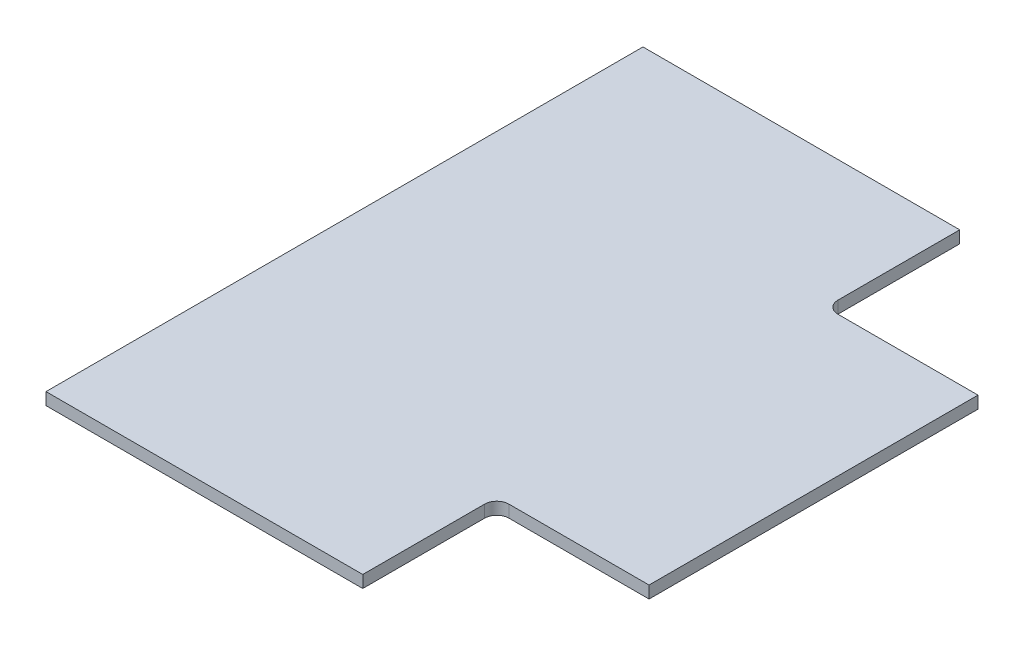
ISO-10303-21;
HEADER;
FILE_DESCRIPTION(('STEP AP214'),'2;1');
FILE_NAME('part.step','',(''),(''),'','','');
FILE_SCHEMA(('AUTOMOTIVE_DESIGN { 1 0 10303 214 1 1 1 1 }'));
ENDSEC;
DATA;
#1=APPLICATION_CONTEXT('core data for automotive mechanical design processes');
#2=APPLICATION_PROTOCOL_DEFINITION('international standard','automotive_design',2000,#1);
#3=PRODUCT_CONTEXT('',#1,'mechanical');
#4=PRODUCT('Part','Part','',(#3));
#5=PRODUCT_RELATED_PRODUCT_CATEGORY('part','',(#4));
#6=PRODUCT_DEFINITION_FORMATION('','',#4);
#7=PRODUCT_DEFINITION_CONTEXT('part definition',#1,'design');
#8=PRODUCT_DEFINITION('design','',#6,#7);
#9=PRODUCT_DEFINITION_SHAPE('','',#8);
#10=(LENGTH_UNIT() NAMED_UNIT(*) SI_UNIT(.MILLI.,.METRE.));
#11=(NAMED_UNIT(*) PLANE_ANGLE_UNIT() SI_UNIT($,.RADIAN.));
#12=(NAMED_UNIT(*) SI_UNIT($,.STERADIAN.) SOLID_ANGLE_UNIT());
#13=UNCERTAINTY_MEASURE_WITH_UNIT(LENGTH_MEASURE(1.E-05),#10,'distance_accuracy_value','');
#14=(GEOMETRIC_REPRESENTATION_CONTEXT(3) GLOBAL_UNCERTAINTY_ASSIGNED_CONTEXT((#13)) GLOBAL_UNIT_ASSIGNED_CONTEXT((#10,
#11,#12)) REPRESENTATION_CONTEXT('',''));
#15=CARTESIAN_POINT('',(0.,0.,0.));
#16=DIRECTION('',(0.,0.,1.));
#17=DIRECTION('',(1.,0.,0.));
#18=AXIS2_PLACEMENT_3D('',#15,#16,#17);
#19=CARTESIAN_POINT('',(52.,2.,49.));
#20=DIRECTION('',(0.,0.,-1.));
#21=DIRECTION('',(-1.,0.,0.));
#22=AXIS2_PLACEMENT_3D('',#19,#20,#21);
#23=PLANE('',#22);
#24=DIRECTION('',(1.,0.,0.));
#25=VECTOR('',#24,1.);
#26=CARTESIAN_POINT('',(52.,0.,49.));
#27=LINE('',#26,#25);
#28=CARTESIAN_POINT('',(0.,0.,49.));
#29=VERTEX_POINT('',#28);
#30=CARTESIAN_POINT('',(52.,0.,49.));
#31=VERTEX_POINT('',#30);
#32=EDGE_CURVE('E141',#29,#31,#27,.T.);
#33=ORIENTED_EDGE('',*,*,#32,.T.);
#34=DIRECTION('',(0.,-1.,0.));
#35=VECTOR('',#34,1.);
#36=CARTESIAN_POINT('',(52.,2.,49.));
#37=LINE('',#36,#35);
#38=CARTESIAN_POINT('',(52.,2.,49.));
#39=VERTEX_POINT('',#38);
#40=EDGE_CURVE('E11',#39,#31,#37,.T.);
#41=ORIENTED_EDGE('',*,*,#40,.F.);
#42=DIRECTION('',(1.,0.,0.));
#43=VECTOR('',#42,1.);
#44=CARTESIAN_POINT('',(52.,2.,49.));
#45=LINE('',#44,#43);
#46=CARTESIAN_POINT('',(0.,2.,49.));
#47=VERTEX_POINT('',#46);
#48=EDGE_CURVE('E159',#47,#39,#45,.T.);
#49=ORIENTED_EDGE('',*,*,#48,.F.);
#50=DIRECTION('',(0.,-1.,0.));
#51=VECTOR('',#50,1.);
#52=CARTESIAN_POINT('',(0.,2.,49.));
#53=LINE('',#52,#51);
#54=EDGE_CURVE('E137',#47,#29,#53,.T.);
#55=ORIENTED_EDGE('',*,*,#54,.T.);
#56=EDGE_LOOP('',(#33,#41,#49,#55));
#57=FACE_BOUND('',#56,.T.);
#58=ADVANCED_FACE('F33',(#57),#23,.F.);
#59=CARTESIAN_POINT('',(52.,2.,29.));
#60=DIRECTION('',(-1.,0.,0.));
#61=DIRECTION('',(0.,0.,1.));
#62=AXIS2_PLACEMENT_3D('',#59,#60,#61);
#63=PLANE('',#62);
#64=DIRECTION('',(0.,0.,-1.));
#65=VECTOR('',#64,1.);
#66=CARTESIAN_POINT('',(52.,0.,29.));
#67=LINE('',#66,#65);
#68=CARTESIAN_POINT('',(52.,0.,29.));
#69=VERTEX_POINT('',#68);
#70=EDGE_CURVE('E144',#31,#69,#67,.T.);
#71=ORIENTED_EDGE('',*,*,#70,.T.);
#72=DIRECTION('',(0.,-1.,0.));
#73=VECTOR('',#72,1.);
#74=CARTESIAN_POINT('',(52.,2.,29.));
#75=LINE('',#74,#73);
#76=CARTESIAN_POINT('',(52.,2.,29.));
#77=VERTEX_POINT('',#76);
#78=EDGE_CURVE('E41',#77,#69,#75,.T.);
#79=ORIENTED_EDGE('',*,*,#78,.F.);
#80=DIRECTION('',(0.,0.,-1.));
#81=VECTOR('',#80,1.);
#82=CARTESIAN_POINT('',(52.,2.,29.));
#83=LINE('',#82,#81);
#84=EDGE_CURVE('E98',#39,#77,#83,.T.);
#85=ORIENTED_EDGE('',*,*,#84,.F.);
#86=ORIENTED_EDGE('',*,*,#40,.T.);
#87=EDGE_LOOP('',(#71,#79,#85,#86));
#88=FACE_BOUND('',#87,.T.);
#89=ADVANCED_FACE('F208',(#88),#63,.F.);
#90=CARTESIAN_POINT('',(54.,2.,29.));
#91=DIRECTION('',(0.,-1.,0.));
#92=DIRECTION('',(0.,0.,-1.));
#93=AXIS2_PLACEMENT_3D('',#90,#91,#92);
#94=CYLINDRICAL_SURFACE('',#93,2.);
#95=CARTESIAN_POINT('',(54.,0.,29.));
#96=DIRECTION('',(0.,-1.,0.));
#97=DIRECTION('',(0.,0.,1.));
#98=AXIS2_PLACEMENT_3D('',#95,#96,#97);
#99=CIRCLE('',#98,2.);
#100=CARTESIAN_POINT('',(54.,0.,27.));
#101=VERTEX_POINT('',#100);
#102=EDGE_CURVE('E146',#69,#101,#99,.T.);
#103=ORIENTED_EDGE('',*,*,#102,.T.);
#104=DIRECTION('',(0.,-1.,0.));
#105=VECTOR('',#104,1.);
#106=CARTESIAN_POINT('',(54.,2.,27.));
#107=LINE('',#106,#105);
#108=CARTESIAN_POINT('',(54.,2.,27.));
#109=VERTEX_POINT('',#108);
#110=EDGE_CURVE('E172',#109,#101,#107,.T.);
#111=ORIENTED_EDGE('',*,*,#110,.F.);
#112=CARTESIAN_POINT('',(54.,2.,29.));
#113=DIRECTION('',(0.,-1.,0.));
#114=DIRECTION('',(0.,0.,1.));
#115=AXIS2_PLACEMENT_3D('',#112,#113,#114);
#116=CIRCLE('',#115,2.);
#117=EDGE_CURVE('E180',#77,#109,#116,.T.);
#118=ORIENTED_EDGE('',*,*,#117,.F.);
#119=ORIENTED_EDGE('',*,*,#78,.T.);
#120=EDGE_LOOP('',(#103,#111,#118,#119));
#121=FACE_BOUND('',#120,.T.);
#122=ADVANCED_FACE('F178',(#121),#94,.F.);
#123=CARTESIAN_POINT('',(77.,2.,27.));
#124=DIRECTION('',(0.,0.,-1.));
#125=DIRECTION('',(-1.,0.,0.));
#126=AXIS2_PLACEMENT_3D('',#123,#124,#125);
#127=PLANE('',#126);
#128=DIRECTION('',(1.,0.,0.));
#129=VECTOR('',#128,1.);
#130=CARTESIAN_POINT('',(77.,0.,27.));
#131=LINE('',#130,#129);
#132=CARTESIAN_POINT('',(77.,0.,27.));
#133=VERTEX_POINT('',#132);
#134=EDGE_CURVE('E148',#101,#133,#131,.T.);
#135=ORIENTED_EDGE('',*,*,#134,.T.);
#136=DIRECTION('',(0.,-1.,0.));
#137=VECTOR('',#136,1.);
#138=CARTESIAN_POINT('',(77.,2.,27.));
#139=LINE('',#138,#137);
#140=CARTESIAN_POINT('',(77.,2.,27.));
#141=VERTEX_POINT('',#140);
#142=EDGE_CURVE('E169',#141,#133,#139,.T.);
#143=ORIENTED_EDGE('',*,*,#142,.F.);
#144=DIRECTION('',(1.,0.,0.));
#145=VECTOR('',#144,1.);
#146=CARTESIAN_POINT('',(77.,2.,27.));
#147=LINE('',#146,#145);
#148=EDGE_CURVE('E198',#109,#141,#147,.T.);
#149=ORIENTED_EDGE('',*,*,#148,.F.);
#150=ORIENTED_EDGE('',*,*,#110,.T.);
#151=EDGE_LOOP('',(#135,#143,#149,#150));
#152=FACE_BOUND('',#151,.T.);
#153=ADVANCED_FACE('F189',(#152),#127,.F.);
#154=CARTESIAN_POINT('',(77.,2.,-27.));
#155=DIRECTION('',(-1.,0.,0.));
#156=DIRECTION('',(0.,0.,1.));
#157=AXIS2_PLACEMENT_3D('',#154,#155,#156);
#158=PLANE('',#157);
#159=DIRECTION('',(0.,0.,-1.));
#160=VECTOR('',#159,1.);
#161=CARTESIAN_POINT('',(77.,0.,-27.));
#162=LINE('',#161,#160);
#163=CARTESIAN_POINT('',(77.,0.,-27.));
#164=VERTEX_POINT('',#163);
#165=EDGE_CURVE('E150',#133,#164,#162,.T.);
#166=ORIENTED_EDGE('',*,*,#165,.T.);
#167=DIRECTION('',(0.,-1.,0.));
#168=VECTOR('',#167,1.);
#169=CARTESIAN_POINT('',(77.,2.,-27.));
#170=LINE('',#169,#168);
#171=CARTESIAN_POINT('',(77.,2.,-27.));
#172=VERTEX_POINT('',#171);
#173=EDGE_CURVE('E166',#172,#164,#170,.T.);
#174=ORIENTED_EDGE('',*,*,#173,.F.);
#175=DIRECTION('',(0.,0.,-1.));
#176=VECTOR('',#175,1.);
#177=CARTESIAN_POINT('',(77.,2.,-27.));
#178=LINE('',#177,#176);
#179=EDGE_CURVE('E195',#141,#172,#178,.T.);
#180=ORIENTED_EDGE('',*,*,#179,.F.);
#181=ORIENTED_EDGE('',*,*,#142,.T.);
#182=EDGE_LOOP('',(#166,#174,#180,#181));
#183=FACE_BOUND('',#182,.T.);
#184=ADVANCED_FACE('F193',(#183),#158,.F.);
#185=CARTESIAN_POINT('',(54.,2.,-27.));
#186=DIRECTION('',(0.,0.,1.));
#187=DIRECTION('',(1.,0.,0.));
#188=AXIS2_PLACEMENT_3D('',#185,#186,#187);
#189=PLANE('',#188);
#190=DIRECTION('',(-1.,0.,0.));
#191=VECTOR('',#190,1.);
#192=CARTESIAN_POINT('',(54.,0.,-27.));
#193=LINE('',#192,#191);
#194=CARTESIAN_POINT('',(54.,0.,-27.));
#195=VERTEX_POINT('',#194);
#196=EDGE_CURVE('E152',#164,#195,#193,.T.);
#197=ORIENTED_EDGE('',*,*,#196,.T.);
#198=DIRECTION('',(0.,-1.,0.));
#199=VECTOR('',#198,1.);
#200=CARTESIAN_POINT('',(54.,2.,-27.));
#201=LINE('',#200,#199);
#202=CARTESIAN_POINT('',(54.,2.,-27.));
#203=VERTEX_POINT('',#202);
#204=EDGE_CURVE('E163',#203,#195,#201,.T.);
#205=ORIENTED_EDGE('',*,*,#204,.F.);
#206=DIRECTION('',(-1.,0.,0.));
#207=VECTOR('',#206,1.);
#208=CARTESIAN_POINT('',(54.,2.,-27.));
#209=LINE('',#208,#207);
#210=EDGE_CURVE('E197',#172,#203,#209,.T.);
#211=ORIENTED_EDGE('',*,*,#210,.F.);
#212=ORIENTED_EDGE('',*,*,#173,.T.);
#213=EDGE_LOOP('',(#197,#205,#211,#212));
#214=FACE_BOUND('',#213,.T.);
#215=ADVANCED_FACE('F220',(#214),#189,.F.);
#216=CARTESIAN_POINT('',(54.,2.,-29.));
#217=DIRECTION('',(0.,-1.,0.));
#218=DIRECTION('',(0.,0.,-1.));
#219=AXIS2_PLACEMENT_3D('',#216,#217,#218);
#220=CYLINDRICAL_SURFACE('',#219,2.);
#221=CARTESIAN_POINT('',(54.,0.,-29.));
#222=DIRECTION('',(0.,-1.,0.));
#223=DIRECTION('',(0.,0.,1.));
#224=AXIS2_PLACEMENT_3D('',#221,#222,#223);
#225=CIRCLE('',#224,2.);
#226=CARTESIAN_POINT('',(52.,0.,-29.));
#227=VERTEX_POINT('',#226);
#228=EDGE_CURVE('E154',#195,#227,#225,.T.);
#229=ORIENTED_EDGE('',*,*,#228,.T.);
#230=DIRECTION('',(0.,-1.,0.));
#231=VECTOR('',#230,1.);
#232=CARTESIAN_POINT('',(52.,2.,-29.));
#233=LINE('',#232,#231);
#234=CARTESIAN_POINT('',(52.,2.,-29.));
#235=VERTEX_POINT('',#234);
#236=EDGE_CURVE('E132',#235,#227,#233,.T.);
#237=ORIENTED_EDGE('',*,*,#236,.F.);
#238=CARTESIAN_POINT('',(54.,2.,-29.));
#239=DIRECTION('',(0.,-1.,0.));
#240=DIRECTION('',(0.,0.,1.));
#241=AXIS2_PLACEMENT_3D('',#238,#239,#240);
#242=CIRCLE('',#241,2.);
#243=EDGE_CURVE('E123',#203,#235,#242,.T.);
#244=ORIENTED_EDGE('',*,*,#243,.F.);
#245=ORIENTED_EDGE('',*,*,#204,.T.);
#246=EDGE_LOOP('',(#229,#237,#244,#245));
#247=FACE_BOUND('',#246,.T.);
#248=ADVANCED_FACE('F223',(#247),#220,.F.);
#249=CARTESIAN_POINT('',(52.,2.,-49.));
#250=DIRECTION('',(-1.,0.,0.));
#251=DIRECTION('',(0.,0.,1.));
#252=AXIS2_PLACEMENT_3D('',#249,#250,#251);
#253=PLANE('',#252);
#254=DIRECTION('',(0.,0.,-1.));
#255=VECTOR('',#254,1.);
#256=CARTESIAN_POINT('',(52.,0.,-49.));
#257=LINE('',#256,#255);
#258=CARTESIAN_POINT('',(52.,0.,-49.));
#259=VERTEX_POINT('',#258);
#260=EDGE_CURVE('E131',#227,#259,#257,.T.);
#261=ORIENTED_EDGE('',*,*,#260,.T.);
#262=DIRECTION('',(0.,-1.,0.));
#263=VECTOR('',#262,1.);
#264=CARTESIAN_POINT('',(52.,2.,-49.));
#265=LINE('',#264,#263);
#266=CARTESIAN_POINT('',(52.,2.,-49.));
#267=VERTEX_POINT('',#266);
#268=EDGE_CURVE('E128',#267,#259,#265,.T.);
#269=ORIENTED_EDGE('',*,*,#268,.F.);
#270=DIRECTION('',(0.,0.,-1.));
#271=VECTOR('',#270,1.);
#272=CARTESIAN_POINT('',(52.,2.,-49.));
#273=LINE('',#272,#271);
#274=EDGE_CURVE('E117',#235,#267,#273,.T.);
#275=ORIENTED_EDGE('',*,*,#274,.F.);
#276=ORIENTED_EDGE('',*,*,#236,.T.);
#277=EDGE_LOOP('',(#261,#269,#275,#276));
#278=FACE_BOUND('',#277,.T.);
#279=ADVANCED_FACE('F129',(#278),#253,.F.);
#280=CARTESIAN_POINT('',(0.,2.,-49.));
#281=DIRECTION('',(0.,0.,1.));
#282=DIRECTION('',(1.,0.,0.));
#283=AXIS2_PLACEMENT_3D('',#280,#281,#282);
#284=PLANE('',#283);
#285=DIRECTION('',(-1.,0.,0.));
#286=VECTOR('',#285,1.);
#287=CARTESIAN_POINT('',(0.,0.,-49.));
#288=LINE('',#287,#286);
#289=CARTESIAN_POINT('',(0.,0.,-49.));
#290=VERTEX_POINT('',#289);
#291=EDGE_CURVE('E84',#259,#290,#288,.T.);
#292=ORIENTED_EDGE('',*,*,#291,.T.);
#293=DIRECTION('',(0.,-1.,0.));
#294=VECTOR('',#293,1.);
#295=CARTESIAN_POINT('',(0.,2.,-49.));
#296=LINE('',#295,#294);
#297=CARTESIAN_POINT('',(0.,2.,-49.));
#298=VERTEX_POINT('',#297);
#299=EDGE_CURVE('E133',#298,#290,#296,.T.);
#300=ORIENTED_EDGE('',*,*,#299,.F.);
#301=DIRECTION('',(-1.,0.,0.));
#302=VECTOR('',#301,1.);
#303=CARTESIAN_POINT('',(0.,2.,-49.));
#304=LINE('',#303,#302);
#305=EDGE_CURVE('E121',#267,#298,#304,.T.);
#306=ORIENTED_EDGE('',*,*,#305,.F.);
#307=ORIENTED_EDGE('',*,*,#268,.T.);
#308=EDGE_LOOP('',(#292,#300,#306,#307));
#309=FACE_BOUND('',#308,.T.);
#310=ADVANCED_FACE('F135',(#309),#284,.F.);
#311=CARTESIAN_POINT('',(0.,2.,49.));
#312=DIRECTION('',(1.,0.,0.));
#313=DIRECTION('',(0.,0.,-1.));
#314=AXIS2_PLACEMENT_3D('',#311,#312,#313);
#315=PLANE('',#314);
#316=DIRECTION('',(0.,0.,1.));
#317=VECTOR('',#316,1.);
#318=CARTESIAN_POINT('',(0.,0.,49.));
#319=LINE('',#318,#317);
#320=EDGE_CURVE('E90',#290,#29,#319,.T.);
#321=ORIENTED_EDGE('',*,*,#320,.T.);
#322=ORIENTED_EDGE('',*,*,#54,.F.);
#323=DIRECTION('',(0.,0.,1.));
#324=VECTOR('',#323,1.);
#325=CARTESIAN_POINT('',(0.,2.,49.));
#326=LINE('',#325,#324);
#327=EDGE_CURVE('E49',#298,#47,#326,.T.);
#328=ORIENTED_EDGE('',*,*,#327,.F.);
#329=ORIENTED_EDGE('',*,*,#299,.T.);
#330=EDGE_LOOP('',(#321,#322,#328,#329));
#331=FACE_BOUND('',#330,.T.);
#332=ADVANCED_FACE('F232',(#331),#315,.F.);
#333=CARTESIAN_POINT('',(54.,2.,-29.));
#334=DIRECTION('',(0.,1.,0.));
#335=DIRECTION('',(0.,0.,1.));
#336=AXIS2_PLACEMENT_3D('',#333,#334,#335);
#337=PLANE('',#336);
#338=ORIENTED_EDGE('',*,*,#48,.T.);
#339=ORIENTED_EDGE('',*,*,#84,.T.);
#340=ORIENTED_EDGE('',*,*,#117,.T.);
#341=ORIENTED_EDGE('',*,*,#148,.T.);
#342=ORIENTED_EDGE('',*,*,#179,.T.);
#343=ORIENTED_EDGE('',*,*,#210,.T.);
#344=ORIENTED_EDGE('',*,*,#243,.T.);
#345=ORIENTED_EDGE('',*,*,#274,.T.);
#346=ORIENTED_EDGE('',*,*,#305,.T.);
#347=ORIENTED_EDGE('',*,*,#327,.T.);
#348=EDGE_LOOP('',(#338,#339,#340,#341,#342,#343,#344,#345,#346,#347));
#349=FACE_BOUND('',#348,.T.);
#350=ADVANCED_FACE('F119',(#349),#337,.T.);
#351=CARTESIAN_POINT('',(54.,0.,-29.));
#352=DIRECTION('',(0.,1.,0.));
#353=DIRECTION('',(0.,0.,1.));
#354=AXIS2_PLACEMENT_3D('',#351,#352,#353);
#355=PLANE('',#354);
#356=ORIENTED_EDGE('',*,*,#32,.F.);
#357=ORIENTED_EDGE('',*,*,#320,.F.);
#358=ORIENTED_EDGE('',*,*,#291,.F.);
#359=ORIENTED_EDGE('',*,*,#260,.F.);
#360=ORIENTED_EDGE('',*,*,#228,.F.);
#361=ORIENTED_EDGE('',*,*,#196,.F.);
#362=ORIENTED_EDGE('',*,*,#165,.F.);
#363=ORIENTED_EDGE('',*,*,#134,.F.);
#364=ORIENTED_EDGE('',*,*,#102,.F.);
#365=ORIENTED_EDGE('',*,*,#70,.F.);
#366=EDGE_LOOP('',(#356,#357,#358,#359,#360,#361,#362,#363,#364,#365));
#367=FACE_BOUND('',#366,.T.);
#368=ADVANCED_FACE('F184',(#367),#355,.F.);
#369=CLOSED_SHELL('',(#58,#89,#122,#153,#184,#215,#248,#279,#310,#332,#350,#368));
#370=MANIFOLD_SOLID_BREP('B2',#369);
#371=ADVANCED_BREP_SHAPE_REPRESENTATION('',(#18,#370),#14);
#372=SHAPE_DEFINITION_REPRESENTATION(#9,#371);
ENDSEC;
END-ISO-10303-21;
